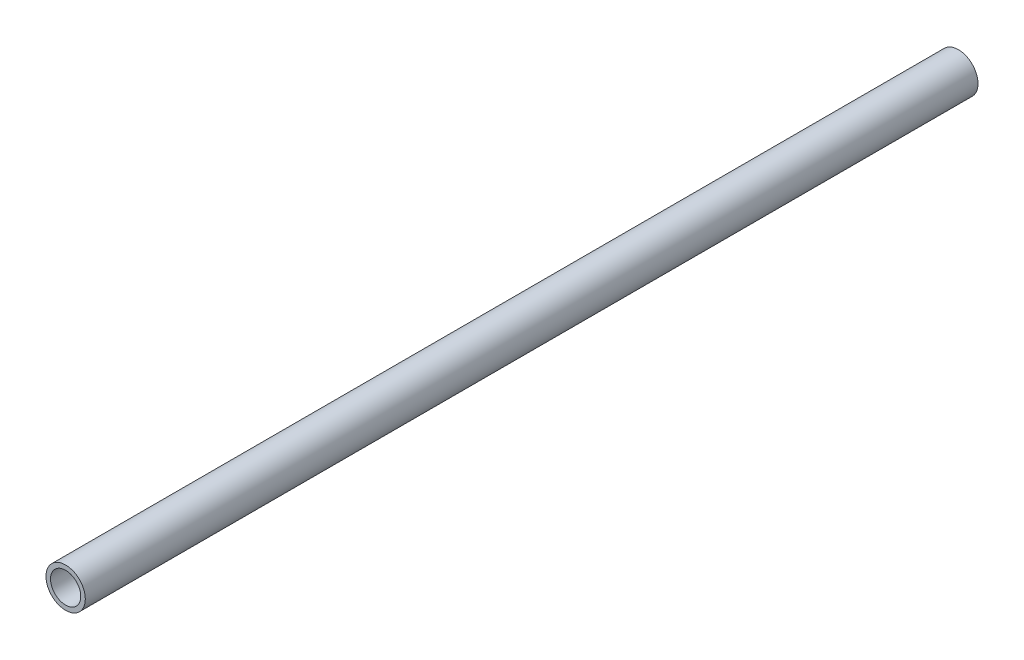
ISO-10303-21;
HEADER;
FILE_DESCRIPTION(('STEP AP214'),'2;1');
FILE_NAME('part.step','',(''),(''),'','','');
FILE_SCHEMA(('AUTOMOTIVE_DESIGN { 1 0 10303 214 1 1 1 1 }'));
ENDSEC;
DATA;
#1=APPLICATION_CONTEXT('core data for automotive mechanical design processes');
#2=APPLICATION_PROTOCOL_DEFINITION('international standard','automotive_design',2000,#1);
#3=PRODUCT_CONTEXT('',#1,'mechanical');
#4=PRODUCT('Part','Part','',(#3));
#5=PRODUCT_RELATED_PRODUCT_CATEGORY('part','',(#4));
#6=PRODUCT_DEFINITION_FORMATION('','',#4);
#7=PRODUCT_DEFINITION_CONTEXT('part definition',#1,'design');
#8=PRODUCT_DEFINITION('design','',#6,#7);
#9=PRODUCT_DEFINITION_SHAPE('','',#8);
#10=(LENGTH_UNIT() NAMED_UNIT(*) SI_UNIT(.MILLI.,.METRE.));
#11=(NAMED_UNIT(*) PLANE_ANGLE_UNIT() SI_UNIT($,.RADIAN.));
#12=(NAMED_UNIT(*) SI_UNIT($,.STERADIAN.) SOLID_ANGLE_UNIT());
#13=UNCERTAINTY_MEASURE_WITH_UNIT(LENGTH_MEASURE(1.E-05),#10,'distance_accuracy_value','');
#14=(GEOMETRIC_REPRESENTATION_CONTEXT(3) GLOBAL_UNCERTAINTY_ASSIGNED_CONTEXT((#13)) GLOBAL_UNIT_ASSIGNED_CONTEXT((#10,
#11,#12)) REPRESENTATION_CONTEXT('',''));
#15=CARTESIAN_POINT('',(0.,0.,0.));
#16=DIRECTION('',(0.,0.,1.));
#17=DIRECTION('',(1.,0.,0.));
#18=AXIS2_PLACEMENT_3D('',#15,#16,#17);
#19=CARTESIAN_POINT('',(0.,0.,0.));
#20=DIRECTION('',(0.,0.,1.));
#21=DIRECTION('',(1.,0.,0.));
#22=AXIS2_PLACEMENT_3D('',#19,#20,#21);
#23=PLANE('',#22);
#24=CARTESIAN_POINT('',(0.,0.,0.));
#25=DIRECTION('',(0.,0.,1.));
#26=DIRECTION('',(1.,0.,0.));
#27=AXIS2_PLACEMENT_3D('',#24,#25,#26);
#28=CIRCLE('',#27,6.35);
#29=CARTESIAN_POINT('',(6.35,0.,0.));
#30=VERTEX_POINT('',#29);
#31=EDGE_CURVE('E41',#30,#30,#28,.T.);
#32=ORIENTED_EDGE('',*,*,#31,.F.);
#33=EDGE_LOOP('',(#32));
#34=FACE_BOUND('',#33,.T.);
#35=CARTESIAN_POINT('',(0.,0.,0.));
#36=DIRECTION('',(0.,0.,1.));
#37=DIRECTION('',(1.,0.,0.));
#38=AXIS2_PLACEMENT_3D('',#35,#36,#37);
#39=CIRCLE('',#38,4.8768);
#40=CARTESIAN_POINT('',(4.8768,0.,0.));
#41=VERTEX_POINT('',#40);
#42=EDGE_CURVE('E53',#41,#41,#39,.T.);
#43=ORIENTED_EDGE('',*,*,#42,.T.);
#44=EDGE_LOOP('',(#43));
#45=FACE_BOUND('',#44,.T.);
#46=ADVANCED_FACE('F37',(#34,#45),#23,.F.);
#47=CARTESIAN_POINT('',(0.,0.,306.250512242138));
#48=DIRECTION('',(0.,0.,-1.));
#49=DIRECTION('',(-1.,0.,0.));
#50=AXIS2_PLACEMENT_3D('',#47,#48,#49);
#51=CYLINDRICAL_SURFACE('',#50,6.35);
#52=CARTESIAN_POINT('',(0.,0.,288.29));
#53=DIRECTION('',(0.,0.,-1.));
#54=DIRECTION('',(-0.981498676058551,-0.19146892409817,0.));
#55=AXIS2_PLACEMENT_3D('',#52,#53,#54);
#56=CIRCLE('',#55,6.35);
#57=CARTESIAN_POINT('',(-6.23251659297183,-1.21582766802343,288.29));
#58=VERTEX_POINT('',#57);
#59=EDGE_CURVE('E10',#58,#58,#56,.T.);
#60=ORIENTED_EDGE('',*,*,#59,.T.);
#61=EDGE_LOOP('',(#60));
#62=FACE_BOUND('',#61,.T.);
#63=ORIENTED_EDGE('',*,*,#31,.T.);
#64=EDGE_LOOP('',(#63));
#65=FACE_BOUND('',#64,.T.);
#66=ADVANCED_FACE('F39',(#62,#65),#51,.T.);
#67=CARTESIAN_POINT('',(0.,0.,306.250512242138));
#68=DIRECTION('',(0.,0.,-1.));
#69=DIRECTION('',(-1.,0.,0.));
#70=AXIS2_PLACEMENT_3D('',#67,#68,#69);
#71=CYLINDRICAL_SURFACE('',#70,4.8768);
#72=CARTESIAN_POINT('',(0.,0.,288.29));
#73=DIRECTION('',(0.,0.,-1.));
#74=DIRECTION('',(-0.981498676058551,-0.19146892409817,0.));
#75=AXIS2_PLACEMENT_3D('',#72,#73,#74);
#76=CIRCLE('',#75,4.8768);
#77=CARTESIAN_POINT('',(-4.78657274340237,-0.933755649042002,288.29));
#78=VERTEX_POINT('',#77);
#79=EDGE_CURVE('E46',#78,#78,#76,.T.);
#80=ORIENTED_EDGE('',*,*,#79,.F.);
#81=EDGE_LOOP('',(#80));
#82=FACE_BOUND('',#81,.T.);
#83=ORIENTED_EDGE('',*,*,#42,.F.);
#84=EDGE_LOOP('',(#83));
#85=FACE_BOUND('',#84,.T.);
#86=ADVANCED_FACE('F67',(#82,#85),#71,.F.);
#87=CARTESIAN_POINT('',(0.,0.,288.29));
#88=DIRECTION('',(0.,0.,-1.));
#89=DIRECTION('',(-0.981498676058551,-0.19146892409817,0.));
#90=AXIS2_PLACEMENT_3D('',#87,#88,#89);
#91=PLANE('',#90);
#92=ORIENTED_EDGE('',*,*,#79,.T.);
#93=EDGE_LOOP('',(#92));
#94=FACE_BOUND('',#93,.T.);
#95=ORIENTED_EDGE('',*,*,#59,.F.);
#96=EDGE_LOOP('',(#95));
#97=FACE_BOUND('',#96,.T.);
#98=ADVANCED_FACE('F71',(#94,#97),#91,.F.);
#99=CLOSED_SHELL('',(#46,#66,#86,#98));
#100=MANIFOLD_SOLID_BREP('B2',#99);
#101=ADVANCED_BREP_SHAPE_REPRESENTATION('',(#18,#100),#14);
#102=SHAPE_DEFINITION_REPRESENTATION(#9,#101);
ENDSEC;
END-ISO-10303-21;
